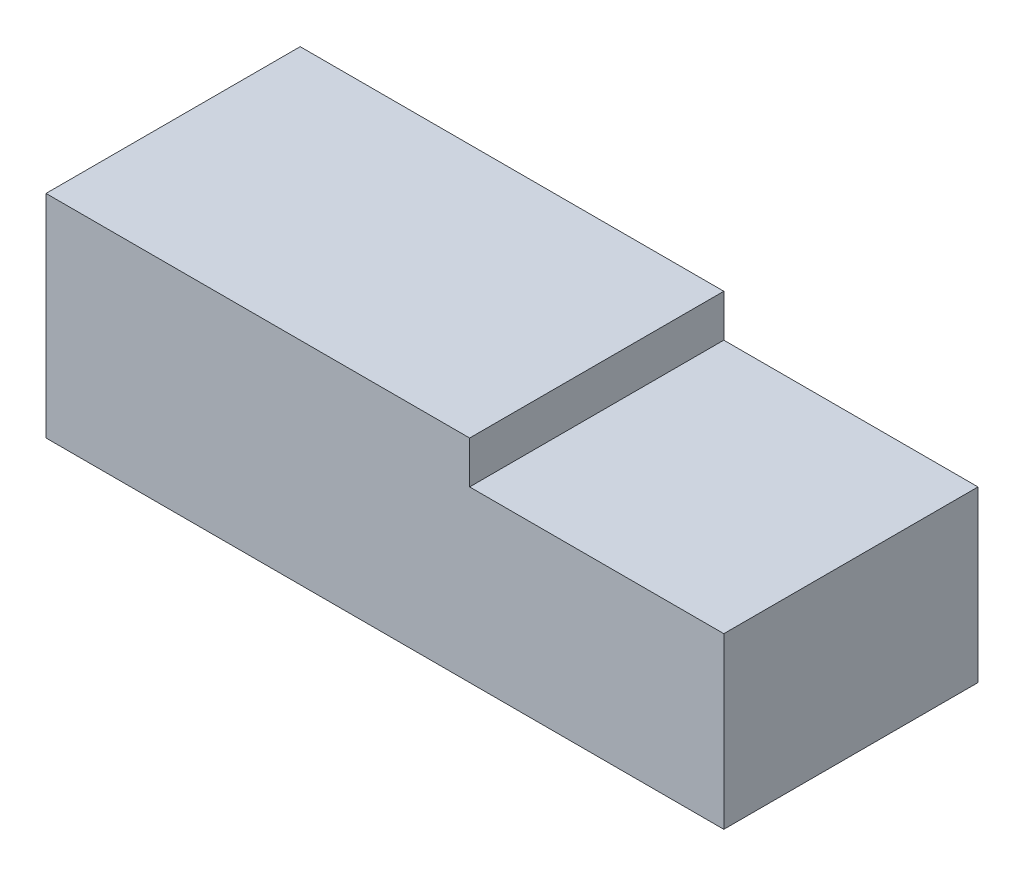
ISO-10303-21;
HEADER;
FILE_DESCRIPTION(('STEP AP214'),'2;1');
FILE_NAME('part.step','',(''),(''),'','','');
FILE_SCHEMA(('AUTOMOTIVE_DESIGN { 1 0 10303 214 1 1 1 1 }'));
ENDSEC;
DATA;
#1=APPLICATION_CONTEXT('core data for automotive mechanical design processes');
#2=APPLICATION_PROTOCOL_DEFINITION('international standard','automotive_design',2000,#1);
#3=PRODUCT_CONTEXT('',#1,'mechanical');
#4=PRODUCT('Part','Part','',(#3));
#5=PRODUCT_RELATED_PRODUCT_CATEGORY('part','',(#4));
#6=PRODUCT_DEFINITION_FORMATION('','',#4);
#7=PRODUCT_DEFINITION_CONTEXT('part definition',#1,'design');
#8=PRODUCT_DEFINITION('design','',#6,#7);
#9=PRODUCT_DEFINITION_SHAPE('','',#8);
#10=(LENGTH_UNIT() NAMED_UNIT(*) SI_UNIT(.MILLI.,.METRE.));
#11=(NAMED_UNIT(*) PLANE_ANGLE_UNIT() SI_UNIT($,.RADIAN.));
#12=(NAMED_UNIT(*) SI_UNIT($,.STERADIAN.) SOLID_ANGLE_UNIT());
#13=UNCERTAINTY_MEASURE_WITH_UNIT(LENGTH_MEASURE(1.E-05),#10,'distance_accuracy_value','');
#14=(GEOMETRIC_REPRESENTATION_CONTEXT(3) GLOBAL_UNCERTAINTY_ASSIGNED_CONTEXT((#13)) GLOBAL_UNIT_ASSIGNED_CONTEXT((#10,
#11,#12)) REPRESENTATION_CONTEXT('',''));
#15=CARTESIAN_POINT('',(0.,0.,0.));
#16=DIRECTION('',(0.,0.,1.));
#17=DIRECTION('',(1.,0.,0.));
#18=AXIS2_PLACEMENT_3D('',#15,#16,#17);
#19=CARTESIAN_POINT('',(63.5,25.4,38.1));
#20=DIRECTION('',(-1.,0.,0.));
#21=DIRECTION('',(0.,0.,1.));
#22=AXIS2_PLACEMENT_3D('',#19,#20,#21);
#23=PLANE('',#22);
#24=DIRECTION('',(0.,1.,0.));
#25=VECTOR('',#24,1.);
#26=CARTESIAN_POINT('',(63.5,25.4,0.));
#27=LINE('',#26,#25);
#28=CARTESIAN_POINT('',(63.5,25.4,0.));
#29=VERTEX_POINT('',#28);
#30=CARTESIAN_POINT('',(63.5,31.75,0.));
#31=VERTEX_POINT('',#30);
#32=EDGE_CURVE('E132',#29,#31,#27,.T.);
#33=ORIENTED_EDGE('',*,*,#32,.T.);
#34=DIRECTION('',(0.,0.,-1.));
#35=VECTOR('',#34,1.);
#36=CARTESIAN_POINT('',(63.5,31.75,38.1));
#37=LINE('',#36,#35);
#38=CARTESIAN_POINT('',(63.5,31.75,38.1));
#39=VERTEX_POINT('',#38);
#40=EDGE_CURVE('E11',#39,#31,#37,.T.);
#41=ORIENTED_EDGE('',*,*,#40,.F.);
#42=DIRECTION('',(0.,1.,0.));
#43=VECTOR('',#42,1.);
#44=CARTESIAN_POINT('',(63.5,25.4,38.1));
#45=LINE('',#44,#43);
#46=CARTESIAN_POINT('',(63.5,25.4,38.1));
#47=VERTEX_POINT('',#46);
#48=EDGE_CURVE('E148',#47,#39,#45,.T.);
#49=ORIENTED_EDGE('',*,*,#48,.F.);
#50=DIRECTION('',(0.,0.,-1.));
#51=VECTOR('',#50,1.);
#52=CARTESIAN_POINT('',(63.5,25.4,38.1));
#53=LINE('',#52,#51);
#54=EDGE_CURVE('E128',#47,#29,#53,.T.);
#55=ORIENTED_EDGE('',*,*,#54,.T.);
#56=EDGE_LOOP('',(#33,#41,#49,#55));
#57=FACE_BOUND('',#56,.T.);
#58=ADVANCED_FACE('F43',(#57),#23,.F.);
#59=CARTESIAN_POINT('',(63.5,31.75,38.1));
#60=DIRECTION('',(0.,-1.,0.));
#61=DIRECTION('',(1.,0.,0.));
#62=AXIS2_PLACEMENT_3D('',#59,#60,#61);
#63=PLANE('',#62);
#64=DIRECTION('',(-1.,0.,0.));
#65=VECTOR('',#64,1.);
#66=CARTESIAN_POINT('',(63.5,31.75,0.));
#67=LINE('',#66,#65);
#68=CARTESIAN_POINT('',(0.,31.75,0.));
#69=VERTEX_POINT('',#68);
#70=EDGE_CURVE('E136',#31,#69,#67,.T.);
#71=ORIENTED_EDGE('',*,*,#70,.T.);
#72=DIRECTION('',(0.,0.,-1.));
#73=VECTOR('',#72,1.);
#74=CARTESIAN_POINT('',(0.,31.75,38.1));
#75=LINE('',#74,#73);
#76=CARTESIAN_POINT('',(0.,31.75,38.1));
#77=VERTEX_POINT('',#76);
#78=EDGE_CURVE('E52',#77,#69,#75,.T.);
#79=ORIENTED_EDGE('',*,*,#78,.F.);
#80=DIRECTION('',(-1.,0.,0.));
#81=VECTOR('',#80,1.);
#82=CARTESIAN_POINT('',(63.5,31.75,38.1));
#83=LINE('',#82,#81);
#84=EDGE_CURVE('E97',#39,#77,#83,.T.);
#85=ORIENTED_EDGE('',*,*,#84,.F.);
#86=ORIENTED_EDGE('',*,*,#40,.T.);
#87=EDGE_LOOP('',(#71,#79,#85,#86));
#88=FACE_BOUND('',#87,.T.);
#89=ADVANCED_FACE('F176',(#88),#63,.F.);
#90=CARTESIAN_POINT('',(0.,31.75,38.1));
#91=DIRECTION('',(1.,0.,0.));
#92=DIRECTION('',(0.,1.,0.));
#93=AXIS2_PLACEMENT_3D('',#90,#91,#92);
#94=PLANE('',#93);
#95=DIRECTION('',(0.,-1.,0.));
#96=VECTOR('',#95,1.);
#97=CARTESIAN_POINT('',(0.,31.75,0.));
#98=LINE('',#97,#96);
#99=CARTESIAN_POINT('',(0.,0.,0.));
#100=VERTEX_POINT('',#99);
#101=EDGE_CURVE('E139',#69,#100,#98,.T.);
#102=ORIENTED_EDGE('',*,*,#101,.T.);
#103=DIRECTION('',(0.,0.,-1.));
#104=VECTOR('',#103,1.);
#105=CARTESIAN_POINT('',(0.,0.,38.1));
#106=LINE('',#105,#104);
#107=CARTESIAN_POINT('',(0.,0.,38.1));
#108=VERTEX_POINT('',#107);
#109=EDGE_CURVE('E121',#108,#100,#106,.T.);
#110=ORIENTED_EDGE('',*,*,#109,.F.);
#111=DIRECTION('',(0.,-1.,0.));
#112=VECTOR('',#111,1.);
#113=CARTESIAN_POINT('',(0.,31.75,38.1));
#114=LINE('',#113,#112);
#115=EDGE_CURVE('E110',#77,#108,#114,.T.);
#116=ORIENTED_EDGE('',*,*,#115,.F.);
#117=ORIENTED_EDGE('',*,*,#78,.T.);
#118=EDGE_LOOP('',(#102,#110,#116,#117));
#119=FACE_BOUND('',#118,.T.);
#120=ADVANCED_FACE('F158',(#119),#94,.F.);
#121=CARTESIAN_POINT('',(0.,0.,38.1));
#122=DIRECTION('',(0.,1.,0.));
#123=DIRECTION('',(0.,0.,1.));
#124=AXIS2_PLACEMENT_3D('',#121,#122,#123);
#125=PLANE('',#124);
#126=DIRECTION('',(1.,0.,0.));
#127=VECTOR('',#126,1.);
#128=CARTESIAN_POINT('',(0.,0.,0.));
#129=LINE('',#128,#127);
#130=CARTESIAN_POINT('',(101.6,0.,0.));
#131=VERTEX_POINT('',#130);
#132=EDGE_CURVE('E119',#100,#131,#129,.T.);
#133=ORIENTED_EDGE('',*,*,#132,.T.);
#134=DIRECTION('',(0.,0.,-1.));
#135=VECTOR('',#134,1.);
#136=CARTESIAN_POINT('',(101.6,0.,38.1));
#137=LINE('',#136,#135);
#138=CARTESIAN_POINT('',(101.6,0.,38.1));
#139=VERTEX_POINT('',#138);
#140=EDGE_CURVE('E116',#139,#131,#137,.T.);
#141=ORIENTED_EDGE('',*,*,#140,.F.);
#142=DIRECTION('',(1.,0.,0.));
#143=VECTOR('',#142,1.);
#144=CARTESIAN_POINT('',(0.,0.,38.1));
#145=LINE('',#144,#143);
#146=EDGE_CURVE('E104',#108,#139,#145,.T.);
#147=ORIENTED_EDGE('',*,*,#146,.F.);
#148=ORIENTED_EDGE('',*,*,#109,.T.);
#149=EDGE_LOOP('',(#133,#141,#147,#148));
#150=FACE_BOUND('',#149,.T.);
#151=ADVANCED_FACE('F117',(#150),#125,.F.);
#152=CARTESIAN_POINT('',(101.6,0.,38.1));
#153=DIRECTION('',(-1.,0.,0.));
#154=DIRECTION('',(0.,0.,1.));
#155=AXIS2_PLACEMENT_3D('',#152,#153,#154);
#156=PLANE('',#155);
#157=DIRECTION('',(0.,1.,0.));
#158=VECTOR('',#157,1.);
#159=CARTESIAN_POINT('',(101.6,0.,0.));
#160=LINE('',#159,#158);
#161=CARTESIAN_POINT('',(101.6,25.4,0.));
#162=VERTEX_POINT('',#161);
#163=EDGE_CURVE('E83',#131,#162,#160,.T.);
#164=ORIENTED_EDGE('',*,*,#163,.T.);
#165=DIRECTION('',(0.,0.,-1.));
#166=VECTOR('',#165,1.);
#167=CARTESIAN_POINT('',(101.6,25.4,38.1));
#168=LINE('',#167,#166);
#169=CARTESIAN_POINT('',(101.6,25.4,38.1));
#170=VERTEX_POINT('',#169);
#171=EDGE_CURVE('E122',#170,#162,#168,.T.);
#172=ORIENTED_EDGE('',*,*,#171,.F.);
#173=DIRECTION('',(0.,1.,0.));
#174=VECTOR('',#173,1.);
#175=CARTESIAN_POINT('',(101.6,0.,38.1));
#176=LINE('',#175,#174);
#177=EDGE_CURVE('E108',#139,#170,#176,.T.);
#178=ORIENTED_EDGE('',*,*,#177,.F.);
#179=ORIENTED_EDGE('',*,*,#140,.T.);
#180=EDGE_LOOP('',(#164,#172,#178,#179));
#181=FACE_BOUND('',#180,.T.);
#182=ADVANCED_FACE('F124',(#181),#156,.F.);
#183=CARTESIAN_POINT('',(101.6,25.4,38.1));
#184=DIRECTION('',(0.,-1.,0.));
#185=DIRECTION('',(0.,0.,-1.));
#186=AXIS2_PLACEMENT_3D('',#183,#184,#185);
#187=PLANE('',#186);
#188=DIRECTION('',(-1.,0.,0.));
#189=VECTOR('',#188,1.);
#190=CARTESIAN_POINT('',(101.6,25.4,0.));
#191=LINE('',#190,#189);
#192=EDGE_CURVE('E89',#162,#29,#191,.T.);
#193=ORIENTED_EDGE('',*,*,#192,.T.);
#194=ORIENTED_EDGE('',*,*,#54,.F.);
#195=DIRECTION('',(-1.,0.,0.));
#196=VECTOR('',#195,1.);
#197=CARTESIAN_POINT('',(101.6,25.4,38.1));
#198=LINE('',#197,#196);
#199=EDGE_CURVE('E60',#170,#47,#198,.T.);
#200=ORIENTED_EDGE('',*,*,#199,.F.);
#201=ORIENTED_EDGE('',*,*,#171,.T.);
#202=EDGE_LOOP('',(#193,#194,#200,#201));
#203=FACE_BOUND('',#202,.T.);
#204=ADVANCED_FACE('F165',(#203),#187,.F.);
#205=CARTESIAN_POINT('',(0.,0.,38.1));
#206=DIRECTION('',(0.,0.,1.));
#207=DIRECTION('',(1.,0.,0.));
#208=AXIS2_PLACEMENT_3D('',#205,#206,#207);
#209=PLANE('',#208);
#210=ORIENTED_EDGE('',*,*,#48,.T.);
#211=ORIENTED_EDGE('',*,*,#84,.T.);
#212=ORIENTED_EDGE('',*,*,#115,.T.);
#213=ORIENTED_EDGE('',*,*,#146,.T.);
#214=ORIENTED_EDGE('',*,*,#177,.T.);
#215=ORIENTED_EDGE('',*,*,#199,.T.);
#216=EDGE_LOOP('',(#210,#211,#212,#213,#214,#215));
#217=FACE_BOUND('',#216,.T.);
#218=ADVANCED_FACE('F106',(#217),#209,.T.);
#219=CARTESIAN_POINT('',(0.,0.,0.));
#220=DIRECTION('',(0.,0.,1.));
#221=DIRECTION('',(1.,0.,0.));
#222=AXIS2_PLACEMENT_3D('',#219,#220,#221);
#223=PLANE('',#222);
#224=ORIENTED_EDGE('',*,*,#32,.F.);
#225=ORIENTED_EDGE('',*,*,#192,.F.);
#226=ORIENTED_EDGE('',*,*,#163,.F.);
#227=ORIENTED_EDGE('',*,*,#132,.F.);
#228=ORIENTED_EDGE('',*,*,#101,.F.);
#229=ORIENTED_EDGE('',*,*,#70,.F.);
#230=EDGE_LOOP('',(#224,#225,#226,#227,#228,#229));
#231=FACE_BOUND('',#230,.T.);
#232=ADVANCED_FACE('F161',(#231),#223,.F.);
#233=CLOSED_SHELL('',(#58,#89,#120,#151,#182,#204,#218,#232));
#234=MANIFOLD_SOLID_BREP('B2',#233);
#235=ADVANCED_BREP_SHAPE_REPRESENTATION('',(#18,#234),#14);
#236=SHAPE_DEFINITION_REPRESENTATION(#9,#235);
ENDSEC;
END-ISO-10303-21;
